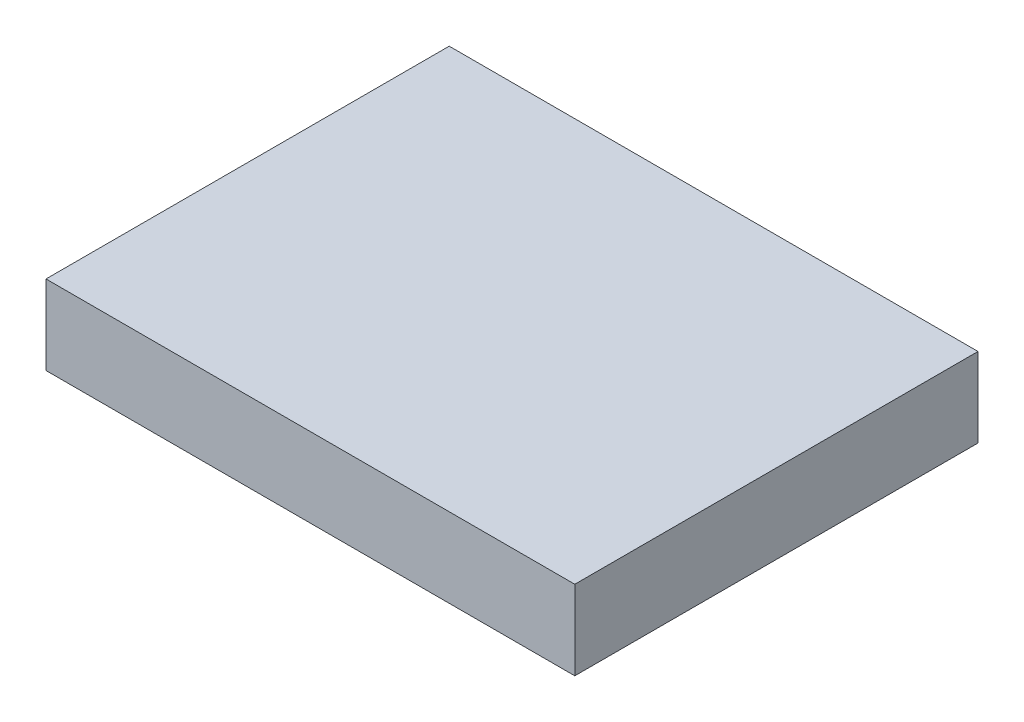
ISO-10303-21;
HEADER;
FILE_DESCRIPTION(('STEP AP214'),'2;1');
FILE_NAME('part.step','',(''),(''),'','','');
FILE_SCHEMA(('AUTOMOTIVE_DESIGN { 1 0 10303 214 1 1 1 1 }'));
ENDSEC;
DATA;
#1=APPLICATION_CONTEXT('core data for automotive mechanical design processes');
#2=APPLICATION_PROTOCOL_DEFINITION('international standard','automotive_design',2000,#1);
#3=PRODUCT_CONTEXT('',#1,'mechanical');
#4=PRODUCT('Part','Part','',(#3));
#5=PRODUCT_RELATED_PRODUCT_CATEGORY('part','',(#4));
#6=PRODUCT_DEFINITION_FORMATION('','',#4);
#7=PRODUCT_DEFINITION_CONTEXT('part definition',#1,'design');
#8=PRODUCT_DEFINITION('design','',#6,#7);
#9=PRODUCT_DEFINITION_SHAPE('','',#8);
#10=(LENGTH_UNIT() NAMED_UNIT(*) SI_UNIT(.MILLI.,.METRE.));
#11=(NAMED_UNIT(*) PLANE_ANGLE_UNIT() SI_UNIT($,.RADIAN.));
#12=(NAMED_UNIT(*) SI_UNIT($,.STERADIAN.) SOLID_ANGLE_UNIT());
#13=UNCERTAINTY_MEASURE_WITH_UNIT(LENGTH_MEASURE(1.E-05),#10,'distance_accuracy_value','');
#14=(GEOMETRIC_REPRESENTATION_CONTEXT(3) GLOBAL_UNCERTAINTY_ASSIGNED_CONTEXT((#13)) GLOBAL_UNIT_ASSIGNED_CONTEXT((#10,
#11,#12)) REPRESENTATION_CONTEXT('',''));
#15=CARTESIAN_POINT('',(0.,0.,0.));
#16=DIRECTION('',(0.,0.,1.));
#17=DIRECTION('',(1.,0.,0.));
#18=AXIS2_PLACEMENT_3D('',#15,#16,#17);
#19=CARTESIAN_POINT('',(-40.,12.,30.5));
#20=DIRECTION('',(1.,0.,0.));
#21=DIRECTION('',(0.,0.,-1.));
#22=AXIS2_PLACEMENT_3D('',#19,#20,#21);
#23=PLANE('',#22);
#24=DIRECTION('',(0.,0.,1.));
#25=VECTOR('',#24,1.);
#26=CARTESIAN_POINT('',(-40.,0.,30.5));
#27=LINE('',#26,#25);
#28=CARTESIAN_POINT('',(-40.,0.,-30.5));
#29=VERTEX_POINT('',#28);
#30=CARTESIAN_POINT('',(-40.,0.,30.5));
#31=VERTEX_POINT('',#30);
#32=EDGE_CURVE('E108',#29,#31,#27,.T.);
#33=ORIENTED_EDGE('',*,*,#32,.T.);
#34=DIRECTION('',(0.,-1.,0.));
#35=VECTOR('',#34,1.);
#36=CARTESIAN_POINT('',(-40.,12.,30.5));
#37=LINE('',#36,#35);
#38=CARTESIAN_POINT('',(-40.,12.,30.5));
#39=VERTEX_POINT('',#38);
#40=EDGE_CURVE('E11',#39,#31,#37,.T.);
#41=ORIENTED_EDGE('',*,*,#40,.F.);
#42=DIRECTION('',(0.,0.,1.));
#43=VECTOR('',#42,1.);
#44=CARTESIAN_POINT('',(-40.,12.,30.5));
#45=LINE('',#44,#43);
#46=CARTESIAN_POINT('',(-40.,12.,-30.5));
#47=VERTEX_POINT('',#46);
#48=EDGE_CURVE('E96',#47,#39,#45,.T.);
#49=ORIENTED_EDGE('',*,*,#48,.F.);
#50=DIRECTION('',(0.,-1.,0.));
#51=VECTOR('',#50,1.);
#52=CARTESIAN_POINT('',(-40.,12.,-30.5));
#53=LINE('',#52,#51);
#54=EDGE_CURVE('E104',#47,#29,#53,.T.);
#55=ORIENTED_EDGE('',*,*,#54,.T.);
#56=EDGE_LOOP('',(#33,#41,#49,#55));
#57=FACE_BOUND('',#56,.T.);
#58=ADVANCED_FACE('F45',(#57),#23,.F.);
#59=CARTESIAN_POINT('',(40.,12.,30.5));
#60=DIRECTION('',(0.,0.,-1.));
#61=DIRECTION('',(-1.,0.,0.));
#62=AXIS2_PLACEMENT_3D('',#59,#60,#61);
#63=PLANE('',#62);
#64=DIRECTION('',(1.,0.,0.));
#65=VECTOR('',#64,1.);
#66=CARTESIAN_POINT('',(40.,0.,30.5));
#67=LINE('',#66,#65);
#68=CARTESIAN_POINT('',(40.,0.,30.5));
#69=VERTEX_POINT('',#68);
#70=EDGE_CURVE('E100',#31,#69,#67,.T.);
#71=ORIENTED_EDGE('',*,*,#70,.T.);
#72=DIRECTION('',(0.,-1.,0.));
#73=VECTOR('',#72,1.);
#74=CARTESIAN_POINT('',(40.,12.,30.5));
#75=LINE('',#74,#73);
#76=CARTESIAN_POINT('',(40.,12.,30.5));
#77=VERTEX_POINT('',#76);
#78=EDGE_CURVE('E53',#77,#69,#75,.T.);
#79=ORIENTED_EDGE('',*,*,#78,.F.);
#80=DIRECTION('',(1.,0.,0.));
#81=VECTOR('',#80,1.);
#82=CARTESIAN_POINT('',(40.,12.,30.5));
#83=LINE('',#82,#81);
#84=EDGE_CURVE('E91',#39,#77,#83,.T.);
#85=ORIENTED_EDGE('',*,*,#84,.F.);
#86=ORIENTED_EDGE('',*,*,#40,.T.);
#87=EDGE_LOOP('',(#71,#79,#85,#86));
#88=FACE_BOUND('',#87,.T.);
#89=ADVANCED_FACE('F99',(#88),#63,.F.);
#90=CARTESIAN_POINT('',(40.,12.,30.5));
#91=DIRECTION('',(-1.,0.,0.));
#92=DIRECTION('',(0.,0.,1.));
#93=AXIS2_PLACEMENT_3D('',#90,#91,#92);
#94=PLANE('',#93);
#95=DIRECTION('',(0.,0.,-1.));
#96=VECTOR('',#95,1.);
#97=CARTESIAN_POINT('',(40.,0.,30.5));
#98=LINE('',#97,#96);
#99=CARTESIAN_POINT('',(40.,0.,-30.5));
#100=VERTEX_POINT('',#99);
#101=EDGE_CURVE('E78',#69,#100,#98,.T.);
#102=ORIENTED_EDGE('',*,*,#101,.T.);
#103=DIRECTION('',(0.,-1.,0.));
#104=VECTOR('',#103,1.);
#105=CARTESIAN_POINT('',(40.,12.,-30.5));
#106=LINE('',#105,#104);
#107=CARTESIAN_POINT('',(40.,12.,-30.5));
#108=VERTEX_POINT('',#107);
#109=EDGE_CURVE('E101',#108,#100,#106,.T.);
#110=ORIENTED_EDGE('',*,*,#109,.F.);
#111=DIRECTION('',(0.,0.,-1.));
#112=VECTOR('',#111,1.);
#113=CARTESIAN_POINT('',(40.,12.,30.5));
#114=LINE('',#113,#112);
#115=EDGE_CURVE('E94',#77,#108,#114,.T.);
#116=ORIENTED_EDGE('',*,*,#115,.F.);
#117=ORIENTED_EDGE('',*,*,#78,.T.);
#118=EDGE_LOOP('',(#102,#110,#116,#117));
#119=FACE_BOUND('',#118,.T.);
#120=ADVANCED_FACE('F102',(#119),#94,.F.);
#121=CARTESIAN_POINT('',(40.,12.,-30.5));
#122=DIRECTION('',(0.,0.,1.));
#123=DIRECTION('',(1.,0.,0.));
#124=AXIS2_PLACEMENT_3D('',#121,#122,#123);
#125=PLANE('',#124);
#126=DIRECTION('',(-1.,0.,0.));
#127=VECTOR('',#126,1.);
#128=CARTESIAN_POINT('',(40.,0.,-30.5));
#129=LINE('',#128,#127);
#130=EDGE_CURVE('E84',#100,#29,#129,.T.);
#131=ORIENTED_EDGE('',*,*,#130,.T.);
#132=ORIENTED_EDGE('',*,*,#54,.F.);
#133=DIRECTION('',(-1.,0.,0.));
#134=VECTOR('',#133,1.);
#135=CARTESIAN_POINT('',(40.,12.,-30.5));
#136=LINE('',#135,#134);
#137=EDGE_CURVE('E61',#108,#47,#136,.T.);
#138=ORIENTED_EDGE('',*,*,#137,.F.);
#139=ORIENTED_EDGE('',*,*,#109,.T.);
#140=EDGE_LOOP('',(#131,#132,#138,#139));
#141=FACE_BOUND('',#140,.T.);
#142=ADVANCED_FACE('F115',(#141),#125,.F.);
#143=CARTESIAN_POINT('',(0.,12.,0.));
#144=DIRECTION('',(0.,1.,0.));
#145=DIRECTION('',(0.,0.,1.));
#146=AXIS2_PLACEMENT_3D('',#143,#144,#145);
#147=PLANE('',#146);
#148=ORIENTED_EDGE('',*,*,#48,.T.);
#149=ORIENTED_EDGE('',*,*,#84,.T.);
#150=ORIENTED_EDGE('',*,*,#115,.T.);
#151=ORIENTED_EDGE('',*,*,#137,.T.);
#152=EDGE_LOOP('',(#148,#149,#150,#151));
#153=FACE_BOUND('',#152,.T.);
#154=ADVANCED_FACE('F92',(#153),#147,.T.);
#155=CARTESIAN_POINT('',(0.,0.,0.));
#156=DIRECTION('',(0.,1.,0.));
#157=DIRECTION('',(0.,0.,1.));
#158=AXIS2_PLACEMENT_3D('',#155,#156,#157);
#159=PLANE('',#158);
#160=ORIENTED_EDGE('',*,*,#32,.F.);
#161=ORIENTED_EDGE('',*,*,#130,.F.);
#162=ORIENTED_EDGE('',*,*,#101,.F.);
#163=ORIENTED_EDGE('',*,*,#70,.F.);
#164=EDGE_LOOP('',(#160,#161,#162,#163));
#165=FACE_BOUND('',#164,.T.);
#166=ADVANCED_FACE('F118',(#165),#159,.F.);
#167=CLOSED_SHELL('',(#58,#89,#120,#142,#154,#166));
#168=MANIFOLD_SOLID_BREP('B2',#167);
#169=ADVANCED_BREP_SHAPE_REPRESENTATION('',(#18,#168),#14);
#170=SHAPE_DEFINITION_REPRESENTATION(#9,#169);
ENDSEC;
END-ISO-10303-21;
